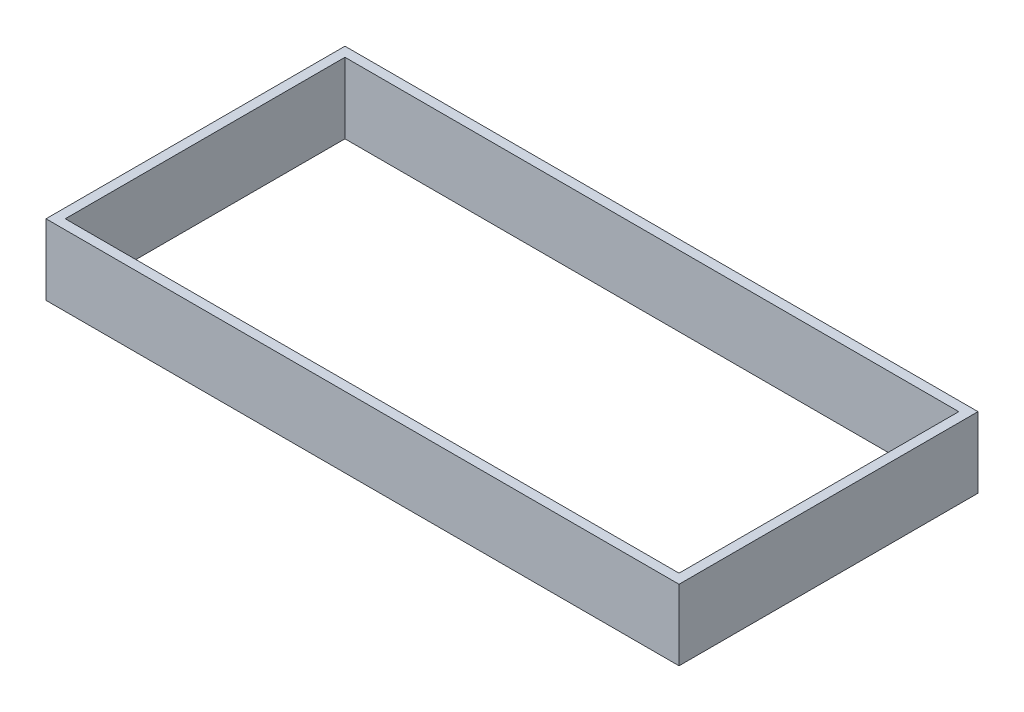
ISO-10303-21;
HEADER;
FILE_DESCRIPTION(('STEP AP214'),'2;1');
FILE_NAME('part.step','',(''),(''),'','','');
FILE_SCHEMA(('AUTOMOTIVE_DESIGN { 1 0 10303 214 1 1 1 1 }'));
ENDSEC;
DATA;
#1=APPLICATION_CONTEXT('core data for automotive mechanical design processes');
#2=APPLICATION_PROTOCOL_DEFINITION('international standard','automotive_design',2000,#1);
#3=PRODUCT_CONTEXT('',#1,'mechanical');
#4=PRODUCT('Part','Part','',(#3));
#5=PRODUCT_RELATED_PRODUCT_CATEGORY('part','',(#4));
#6=PRODUCT_DEFINITION_FORMATION('','',#4);
#7=PRODUCT_DEFINITION_CONTEXT('part definition',#1,'design');
#8=PRODUCT_DEFINITION('design','',#6,#7);
#9=PRODUCT_DEFINITION_SHAPE('','',#8);
#10=(LENGTH_UNIT() NAMED_UNIT(*) SI_UNIT(.MILLI.,.METRE.));
#11=(NAMED_UNIT(*) PLANE_ANGLE_UNIT() SI_UNIT($,.RADIAN.));
#12=(NAMED_UNIT(*) SI_UNIT($,.STERADIAN.) SOLID_ANGLE_UNIT());
#13=UNCERTAINTY_MEASURE_WITH_UNIT(LENGTH_MEASURE(1.E-05),#10,'distance_accuracy_value','');
#14=(GEOMETRIC_REPRESENTATION_CONTEXT(3) GLOBAL_UNCERTAINTY_ASSIGNED_CONTEXT((#13)) GLOBAL_UNIT_ASSIGNED_CONTEXT((#10,
#11,#12)) REPRESENTATION_CONTEXT('',''));
#15=CARTESIAN_POINT('',(0.,0.,0.));
#16=DIRECTION('',(0.,0.,1.));
#17=DIRECTION('',(1.,0.,0.));
#18=AXIS2_PLACEMENT_3D('',#15,#16,#17);
#19=CARTESIAN_POINT('',(0.,14.7,0.));
#20=DIRECTION('',(0.,1.,0.));
#21=DIRECTION('',(0.,0.,1.));
#22=AXIS2_PLACEMENT_3D('',#19,#20,#21);
#23=PLANE('',#22);
#24=DIRECTION('',(0.,0.,1.));
#25=VECTOR('',#24,1.);
#26=CARTESIAN_POINT('',(-65.85,14.7,-31.1));
#27=LINE('',#26,#25);
#28=CARTESIAN_POINT('',(-65.85,14.7,-31.1));
#29=VERTEX_POINT('',#28);
#30=CARTESIAN_POINT('',(-65.85,14.7,31.1));
#31=VERTEX_POINT('',#30);
#32=EDGE_CURVE('E176',#29,#31,#27,.T.);
#33=ORIENTED_EDGE('',*,*,#32,.T.);
#34=DIRECTION('',(1.,0.,0.));
#35=VECTOR('',#34,1.);
#36=CARTESIAN_POINT('',(-65.85,14.7,31.1));
#37=LINE('',#36,#35);
#38=CARTESIAN_POINT('',(65.85,14.7,31.1));
#39=VERTEX_POINT('',#38);
#40=EDGE_CURVE('E180',#31,#39,#37,.T.);
#41=ORIENTED_EDGE('',*,*,#40,.T.);
#42=DIRECTION('',(0.,0.,1.));
#43=VECTOR('',#42,1.);
#44=CARTESIAN_POINT('',(65.85,14.7,-31.1));
#45=LINE('',#44,#43);
#46=CARTESIAN_POINT('',(65.85,14.7,-31.1));
#47=VERTEX_POINT('',#46);
#48=EDGE_CURVE('E184',#47,#39,#45,.T.);
#49=ORIENTED_EDGE('',*,*,#48,.F.);
#50=DIRECTION('',(1.,0.,0.));
#51=VECTOR('',#50,1.);
#52=CARTESIAN_POINT('',(-65.85,14.7,-31.1));
#53=LINE('',#52,#51);
#54=EDGE_CURVE('E188',#29,#47,#53,.T.);
#55=ORIENTED_EDGE('',*,*,#54,.F.);
#56=EDGE_LOOP('',(#33,#41,#49,#55));
#57=FACE_BOUND('',#56,.T.);
#58=DIRECTION('',(1.,0.,0.));
#59=VECTOR('',#58,1.);
#60=CARTESIAN_POINT('',(-63.85,14.7,29.1));
#61=LINE('',#60,#59);
#62=CARTESIAN_POINT('',(-63.85,14.7,29.1));
#63=VERTEX_POINT('',#62);
#64=CARTESIAN_POINT('',(63.85,14.7,29.1));
#65=VERTEX_POINT('',#64);
#66=EDGE_CURVE('E139',#63,#65,#61,.T.);
#67=ORIENTED_EDGE('',*,*,#66,.F.);
#68=DIRECTION('',(0.,0.,1.));
#69=VECTOR('',#68,1.);
#70=CARTESIAN_POINT('',(-63.85,14.7,-29.1));
#71=LINE('',#70,#69);
#72=CARTESIAN_POINT('',(-63.85,14.7,-29.1));
#73=VERTEX_POINT('',#72);
#74=EDGE_CURVE('E129',#73,#63,#71,.T.);
#75=ORIENTED_EDGE('',*,*,#74,.F.);
#76=DIRECTION('',(1.,0.,0.));
#77=VECTOR('',#76,1.);
#78=CARTESIAN_POINT('',(-63.85,14.7,-29.1));
#79=LINE('',#78,#77);
#80=CARTESIAN_POINT('',(63.85,14.7,-29.1));
#81=VERTEX_POINT('',#80);
#82=EDGE_CURVE('E153',#73,#81,#79,.T.);
#83=ORIENTED_EDGE('',*,*,#82,.T.);
#84=DIRECTION('',(0.,0.,1.));
#85=VECTOR('',#84,1.);
#86=CARTESIAN_POINT('',(63.85,14.7,-29.1));
#87=LINE('',#86,#85);
#88=EDGE_CURVE('E79',#81,#65,#87,.T.);
#89=ORIENTED_EDGE('',*,*,#88,.T.);
#90=EDGE_LOOP('',(#67,#75,#83,#89));
#91=FACE_BOUND('',#90,.T.);
#92=ADVANCED_FACE('F63',(#57,#91),#23,.T.);
#93=CARTESIAN_POINT('',(0.,0.,0.));
#94=DIRECTION('',(0.,1.,0.));
#95=DIRECTION('',(0.,0.,1.));
#96=AXIS2_PLACEMENT_3D('',#93,#94,#95);
#97=PLANE('',#96);
#98=DIRECTION('',(0.,0.,1.));
#99=VECTOR('',#98,1.);
#100=CARTESIAN_POINT('',(-65.85,0.,-31.1));
#101=LINE('',#100,#99);
#102=CARTESIAN_POINT('',(-65.85,0.,-31.1));
#103=VERTEX_POINT('',#102);
#104=CARTESIAN_POINT('',(-65.85,0.,31.1));
#105=VERTEX_POINT('',#104);
#106=EDGE_CURVE('E147',#103,#105,#101,.T.);
#107=ORIENTED_EDGE('',*,*,#106,.F.);
#108=DIRECTION('',(1.,0.,0.));
#109=VECTOR('',#108,1.);
#110=CARTESIAN_POINT('',(-65.85,0.,-31.1));
#111=LINE('',#110,#109);
#112=CARTESIAN_POINT('',(65.85,0.,-31.1));
#113=VERTEX_POINT('',#112);
#114=EDGE_CURVE('E181',#103,#113,#111,.T.);
#115=ORIENTED_EDGE('',*,*,#114,.T.);
#116=DIRECTION('',(0.,0.,1.));
#117=VECTOR('',#116,1.);
#118=CARTESIAN_POINT('',(65.85,0.,-31.1));
#119=LINE('',#118,#117);
#120=CARTESIAN_POINT('',(65.85,0.,31.1));
#121=VERTEX_POINT('',#120);
#122=EDGE_CURVE('E200',#113,#121,#119,.T.);
#123=ORIENTED_EDGE('',*,*,#122,.T.);
#124=DIRECTION('',(1.,0.,0.));
#125=VECTOR('',#124,1.);
#126=CARTESIAN_POINT('',(-65.85,0.,31.1));
#127=LINE('',#126,#125);
#128=EDGE_CURVE('E196',#105,#121,#127,.T.);
#129=ORIENTED_EDGE('',*,*,#128,.F.);
#130=EDGE_LOOP('',(#107,#115,#123,#129));
#131=FACE_BOUND('',#130,.T.);
#132=DIRECTION('',(0.,0.,1.));
#133=VECTOR('',#132,1.);
#134=CARTESIAN_POINT('',(-63.85,0.,-29.1));
#135=LINE('',#134,#133);
#136=CARTESIAN_POINT('',(-63.85,0.,-29.1));
#137=VERTEX_POINT('',#136);
#138=CARTESIAN_POINT('',(-63.85,0.,29.1));
#139=VERTEX_POINT('',#138);
#140=EDGE_CURVE('E87',#137,#139,#135,.T.);
#141=ORIENTED_EDGE('',*,*,#140,.T.);
#142=DIRECTION('',(1.,0.,0.));
#143=VECTOR('',#142,1.);
#144=CARTESIAN_POINT('',(-63.85,0.,29.1));
#145=LINE('',#144,#143);
#146=CARTESIAN_POINT('',(63.85,0.,29.1));
#147=VERTEX_POINT('',#146);
#148=EDGE_CURVE('E145',#139,#147,#145,.T.);
#149=ORIENTED_EDGE('',*,*,#148,.T.);
#150=DIRECTION('',(0.,0.,1.));
#151=VECTOR('',#150,1.);
#152=CARTESIAN_POINT('',(63.85,0.,-29.1));
#153=LINE('',#152,#151);
#154=CARTESIAN_POINT('',(63.85,0.,-29.1));
#155=VERTEX_POINT('',#154);
#156=EDGE_CURVE('E162',#155,#147,#153,.T.);
#157=ORIENTED_EDGE('',*,*,#156,.F.);
#158=DIRECTION('',(1.,0.,0.));
#159=VECTOR('',#158,1.);
#160=CARTESIAN_POINT('',(-63.85,0.,-29.1));
#161=LINE('',#160,#159);
#162=EDGE_CURVE('E140',#137,#155,#161,.T.);
#163=ORIENTED_EDGE('',*,*,#162,.F.);
#164=EDGE_LOOP('',(#141,#149,#157,#163));
#165=FACE_BOUND('',#164,.T.);
#166=ADVANCED_FACE('F222',(#131,#165),#97,.F.);
#167=CARTESIAN_POINT('',(-65.85,14.7,-31.1));
#168=DIRECTION('',(1.,0.,0.));
#169=DIRECTION('',(0.,0.,-1.));
#170=AXIS2_PLACEMENT_3D('',#167,#168,#169);
#171=PLANE('',#170);
#172=ORIENTED_EDGE('',*,*,#106,.T.);
#173=DIRECTION('',(0.,-1.,0.));
#174=VECTOR('',#173,1.);
#175=CARTESIAN_POINT('',(-65.85,14.7,31.1));
#176=LINE('',#175,#174);
#177=EDGE_CURVE('E12',#31,#105,#176,.T.);
#178=ORIENTED_EDGE('',*,*,#177,.F.);
#179=ORIENTED_EDGE('',*,*,#32,.F.);
#180=DIRECTION('',(0.,-1.,0.));
#181=VECTOR('',#180,1.);
#182=CARTESIAN_POINT('',(-65.85,14.7,-31.1));
#183=LINE('',#182,#181);
#184=EDGE_CURVE('E192',#29,#103,#183,.T.);
#185=ORIENTED_EDGE('',*,*,#184,.T.);
#186=EDGE_LOOP('',(#172,#178,#179,#185));
#187=FACE_BOUND('',#186,.T.);
#188=ADVANCED_FACE('F65',(#187),#171,.F.);
#189=CARTESIAN_POINT('',(-65.85,14.7,31.1));
#190=DIRECTION('',(0.,0.,-1.));
#191=DIRECTION('',(-1.,0.,0.));
#192=AXIS2_PLACEMENT_3D('',#189,#190,#191);
#193=PLANE('',#192);
#194=ORIENTED_EDGE('',*,*,#128,.T.);
#195=DIRECTION('',(0.,-1.,0.));
#196=VECTOR('',#195,1.);
#197=CARTESIAN_POINT('',(65.85,14.7,31.1));
#198=LINE('',#197,#196);
#199=EDGE_CURVE('E72',#39,#121,#198,.T.);
#200=ORIENTED_EDGE('',*,*,#199,.F.);
#201=ORIENTED_EDGE('',*,*,#40,.F.);
#202=ORIENTED_EDGE('',*,*,#177,.T.);
#203=EDGE_LOOP('',(#194,#200,#201,#202));
#204=FACE_BOUND('',#203,.T.);
#205=ADVANCED_FACE('F218',(#204),#193,.F.);
#206=CARTESIAN_POINT('',(65.85,14.7,-31.1));
#207=DIRECTION('',(1.,0.,0.));
#208=DIRECTION('',(0.,0.,-1.));
#209=AXIS2_PLACEMENT_3D('',#206,#207,#208);
#210=PLANE('',#209);
#211=ORIENTED_EDGE('',*,*,#122,.F.);
#212=DIRECTION('',(0.,-1.,0.));
#213=VECTOR('',#212,1.);
#214=CARTESIAN_POINT('',(65.85,14.7,-31.1));
#215=LINE('',#214,#213);
#216=EDGE_CURVE('E209',#47,#113,#215,.T.);
#217=ORIENTED_EDGE('',*,*,#216,.F.);
#218=ORIENTED_EDGE('',*,*,#48,.T.);
#219=ORIENTED_EDGE('',*,*,#199,.T.);
#220=EDGE_LOOP('',(#211,#217,#218,#219));
#221=FACE_BOUND('',#220,.T.);
#222=ADVANCED_FACE('F215',(#221),#210,.T.);
#223=CARTESIAN_POINT('',(-65.85,14.7,-31.1));
#224=DIRECTION('',(0.,0.,-1.));
#225=DIRECTION('',(-1.,0.,0.));
#226=AXIS2_PLACEMENT_3D('',#223,#224,#225);
#227=PLANE('',#226);
#228=ORIENTED_EDGE('',*,*,#114,.F.);
#229=ORIENTED_EDGE('',*,*,#184,.F.);
#230=ORIENTED_EDGE('',*,*,#54,.T.);
#231=ORIENTED_EDGE('',*,*,#216,.T.);
#232=EDGE_LOOP('',(#228,#229,#230,#231));
#233=FACE_BOUND('',#232,.T.);
#234=ADVANCED_FACE('F226',(#233),#227,.T.);
#235=CARTESIAN_POINT('',(-63.85,14.7,-29.1));
#236=DIRECTION('',(1.,0.,0.));
#237=DIRECTION('',(0.,0.,-1.));
#238=AXIS2_PLACEMENT_3D('',#235,#236,#237);
#239=PLANE('',#238);
#240=ORIENTED_EDGE('',*,*,#140,.F.);
#241=DIRECTION('',(0.,-1.,0.));
#242=VECTOR('',#241,1.);
#243=CARTESIAN_POINT('',(-63.85,14.7,-29.1));
#244=LINE('',#243,#242);
#245=EDGE_CURVE('E133',#73,#137,#244,.T.);
#246=ORIENTED_EDGE('',*,*,#245,.F.);
#247=ORIENTED_EDGE('',*,*,#74,.T.);
#248=DIRECTION('',(0.,-1.,0.));
#249=VECTOR('',#248,1.);
#250=CARTESIAN_POINT('',(-63.85,14.7,29.1));
#251=LINE('',#250,#249);
#252=EDGE_CURVE('E132',#63,#139,#251,.T.);
#253=ORIENTED_EDGE('',*,*,#252,.T.);
#254=EDGE_LOOP('',(#240,#246,#247,#253));
#255=FACE_BOUND('',#254,.T.);
#256=ADVANCED_FACE('F131',(#255),#239,.T.);
#257=CARTESIAN_POINT('',(-63.85,14.7,29.1));
#258=DIRECTION('',(0.,0.,-1.));
#259=DIRECTION('',(-1.,0.,0.));
#260=AXIS2_PLACEMENT_3D('',#257,#258,#259);
#261=PLANE('',#260);
#262=ORIENTED_EDGE('',*,*,#148,.F.);
#263=ORIENTED_EDGE('',*,*,#252,.F.);
#264=ORIENTED_EDGE('',*,*,#66,.T.);
#265=DIRECTION('',(0.,-1.,0.));
#266=VECTOR('',#265,1.);
#267=CARTESIAN_POINT('',(63.85,14.7,29.1));
#268=LINE('',#267,#266);
#269=EDGE_CURVE('E148',#65,#147,#268,.T.);
#270=ORIENTED_EDGE('',*,*,#269,.T.);
#271=EDGE_LOOP('',(#262,#263,#264,#270));
#272=FACE_BOUND('',#271,.T.);
#273=ADVANCED_FACE('F143',(#272),#261,.T.);
#274=CARTESIAN_POINT('',(63.85,14.7,-29.1));
#275=DIRECTION('',(1.,0.,0.));
#276=DIRECTION('',(0.,0.,-1.));
#277=AXIS2_PLACEMENT_3D('',#274,#275,#276);
#278=PLANE('',#277);
#279=ORIENTED_EDGE('',*,*,#156,.T.);
#280=ORIENTED_EDGE('',*,*,#269,.F.);
#281=ORIENTED_EDGE('',*,*,#88,.F.);
#282=DIRECTION('',(0.,-1.,0.));
#283=VECTOR('',#282,1.);
#284=CARTESIAN_POINT('',(63.85,14.7,-29.1));
#285=LINE('',#284,#283);
#286=EDGE_CURVE('E171',#81,#155,#285,.T.);
#287=ORIENTED_EDGE('',*,*,#286,.T.);
#288=EDGE_LOOP('',(#279,#280,#281,#287));
#289=FACE_BOUND('',#288,.T.);
#290=ADVANCED_FACE('F266',(#289),#278,.F.);
#291=CARTESIAN_POINT('',(-63.85,14.7,-29.1));
#292=DIRECTION('',(0.,0.,-1.));
#293=DIRECTION('',(-1.,0.,0.));
#294=AXIS2_PLACEMENT_3D('',#291,#292,#293);
#295=PLANE('',#294);
#296=ORIENTED_EDGE('',*,*,#162,.T.);
#297=ORIENTED_EDGE('',*,*,#286,.F.);
#298=ORIENTED_EDGE('',*,*,#82,.F.);
#299=ORIENTED_EDGE('',*,*,#245,.T.);
#300=EDGE_LOOP('',(#296,#297,#298,#299));
#301=FACE_BOUND('',#300,.T.);
#302=ADVANCED_FACE('F272',(#301),#295,.F.);
#303=CLOSED_SHELL('',(#92,#166,#188,#205,#222,#234,#256,#273,#290,#302));
#304=MANIFOLD_SOLID_BREP('B2',#303);
#305=ADVANCED_BREP_SHAPE_REPRESENTATION('',(#18,#304),#14);
#306=SHAPE_DEFINITION_REPRESENTATION(#9,#305);
ENDSEC;
END-ISO-10303-21;
